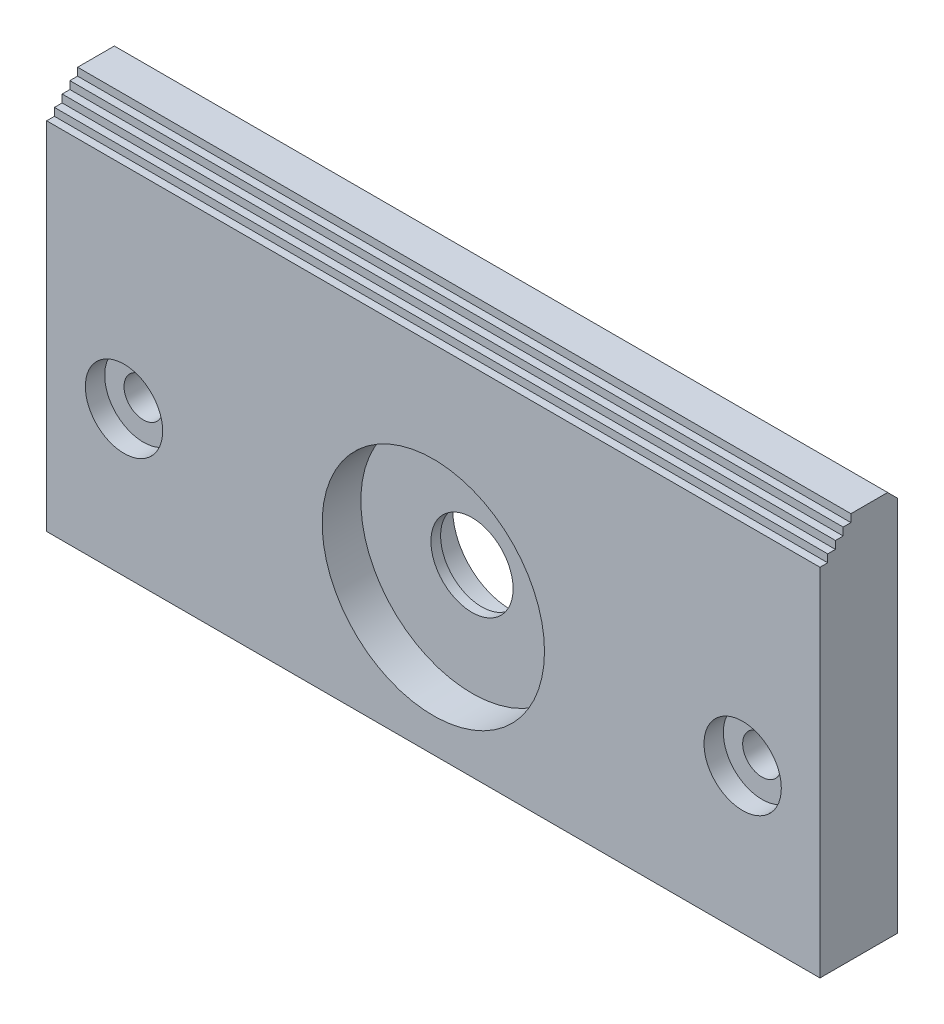
ISO-10303-21;
HEADER;
FILE_DESCRIPTION(('STEP AP214'),'2;1');
FILE_NAME('part.step','',(''),(''),'','','');
FILE_SCHEMA(('AUTOMOTIVE_DESIGN { 1 0 10303 214 1 1 1 1 }'));
ENDSEC;
DATA;
#1=APPLICATION_CONTEXT('core data for automotive mechanical design processes');
#2=APPLICATION_PROTOCOL_DEFINITION('international standard','automotive_design',2000,#1);
#3=PRODUCT_CONTEXT('',#1,'mechanical');
#4=PRODUCT('Part','Part','',(#3));
#5=PRODUCT_RELATED_PRODUCT_CATEGORY('part','',(#4));
#6=PRODUCT_DEFINITION_FORMATION('','',#4);
#7=PRODUCT_DEFINITION_CONTEXT('part definition',#1,'design');
#8=PRODUCT_DEFINITION('design','',#6,#7);
#9=PRODUCT_DEFINITION_SHAPE('','',#8);
#10=(LENGTH_UNIT() NAMED_UNIT(*) SI_UNIT(.MILLI.,.METRE.));
#11=(NAMED_UNIT(*) PLANE_ANGLE_UNIT() SI_UNIT($,.RADIAN.));
#12=(NAMED_UNIT(*) SI_UNIT($,.STERADIAN.) SOLID_ANGLE_UNIT());
#13=UNCERTAINTY_MEASURE_WITH_UNIT(LENGTH_MEASURE(1.E-05),#10,'distance_accuracy_value','');
#14=(GEOMETRIC_REPRESENTATION_CONTEXT(3) GLOBAL_UNCERTAINTY_ASSIGNED_CONTEXT((#13)) GLOBAL_UNIT_ASSIGNED_CONTEXT((#10,
#11,#12)) REPRESENTATION_CONTEXT('',''));
#15=CARTESIAN_POINT('',(0.,0.,0.));
#16=DIRECTION('',(0.,0.,1.));
#17=DIRECTION('',(1.,0.,0.));
#18=AXIS2_PLACEMENT_3D('',#15,#16,#17);
#19=CARTESIAN_POINT('',(40.,15.8333333333333,-0.0010000000000062));
#20=DIRECTION('',(0.,0.,1.));
#21=DIRECTION('',(1.,0.,0.));
#22=AXIS2_PLACEMENT_3D('',#19,#20,#21);
#23=CYLINDRICAL_SURFACE('',#22,4.25);
#24=CARTESIAN_POINT('',(40.,15.8333333333333,4.));
#25=DIRECTION('',(0.,0.,1.));
#26=DIRECTION('',(1.,0.,0.));
#27=AXIS2_PLACEMENT_3D('',#24,#25,#26);
#28=CIRCLE('',#27,4.25);
#29=CARTESIAN_POINT('',(44.25,15.8333333333333,4.));
#30=VERTEX_POINT('',#29);
#31=EDGE_CURVE('E296',#30,#30,#28,.F.);
#32=ORIENTED_EDGE('',*,*,#31,.F.);
#33=EDGE_LOOP('',(#32));
#34=FACE_BOUND('',#33,.T.);
#35=CARTESIAN_POINT('',(40.,15.8333333333333,3.));
#36=DIRECTION('',(0.,0.,-1.));
#37=DIRECTION('',(-1.,0.,0.));
#38=AXIS2_PLACEMENT_3D('',#35,#36,#37);
#39=CIRCLE('',#38,4.25);
#40=CARTESIAN_POINT('',(35.75,15.8333333333333,3.));
#41=VERTEX_POINT('',#40);
#42=EDGE_CURVE('E301',#41,#41,#39,.F.);
#43=ORIENTED_EDGE('',*,*,#42,.F.);
#44=EDGE_LOOP('',(#43));
#45=FACE_BOUND('',#44,.T.);
#46=ADVANCED_FACE('F163',(#34,#45),#23,.F.);
#47=CARTESIAN_POINT('',(80.,40.8333333333333,0.));
#48=DIRECTION('',(0.,1.,0.));
#49=DIRECTION('',(-1.,0.,0.));
#50=AXIS2_PLACEMENT_3D('',#47,#48,#49);
#51=PLANE('',#50);
#52=DIRECTION('',(-1.,0.,0.));
#53=VECTOR('',#52,1.);
#54=CARTESIAN_POINT('',(80.001,40.8333333333333,4.8));
#55=LINE('',#54,#53);
#56=CARTESIAN_POINT('',(80.,40.8333333333333,4.8));
#57=VERTEX_POINT('',#56);
#58=CARTESIAN_POINT('',(0.,40.8333333333333,4.8));
#59=VERTEX_POINT('',#58);
#60=EDGE_CURVE('E338',#57,#59,#55,.T.);
#61=ORIENTED_EDGE('',*,*,#60,.F.);
#62=DIRECTION('',(0.,0.,1.));
#63=VECTOR('',#62,1.);
#64=CARTESIAN_POINT('',(80.,40.8333333333333,0.));
#65=LINE('',#64,#63);
#66=CARTESIAN_POINT('',(80.,40.8333333333333,0.999999999999973));
#67=VERTEX_POINT('',#66);
#68=EDGE_CURVE('E293',#67,#57,#65,.T.);
#69=ORIENTED_EDGE('',*,*,#68,.F.);
#70=DIRECTION('',(-1.,0.,0.));
#71=VECTOR('',#70,1.);
#72=CARTESIAN_POINT('',(0.,40.8333333333333,0.999999999999973));
#73=LINE('',#72,#71);
#74=CARTESIAN_POINT('',(0.,40.8333333333333,0.999999999999973));
#75=VERTEX_POINT('',#74);
#76=EDGE_CURVE('E317',#67,#75,#73,.T.);
#77=ORIENTED_EDGE('',*,*,#76,.T.);
#78=DIRECTION('',(0.,0.,1.));
#79=VECTOR('',#78,1.);
#80=CARTESIAN_POINT('',(0.,40.8333333333333,0.));
#81=LINE('',#80,#79);
#82=EDGE_CURVE('E289',#75,#59,#81,.T.);
#83=ORIENTED_EDGE('',*,*,#82,.T.);
#84=EDGE_LOOP('',(#61,#69,#77,#83));
#85=FACE_BOUND('',#84,.T.);
#86=ADVANCED_FACE('F336',(#85),#51,.T.);
#87=CARTESIAN_POINT('',(0.,40.8333333333333,0.));
#88=DIRECTION('',(-1.,0.,0.));
#89=DIRECTION('',(0.,-1.,0.));
#90=AXIS2_PLACEMENT_3D('',#87,#88,#89);
#91=PLANE('',#90);
#92=DIRECTION('',(0.,0.,1.));
#93=VECTOR('',#92,1.);
#94=CARTESIAN_POINT('',(0.,37.6333333333333,7.2));
#95=LINE('',#94,#93);
#96=CARTESIAN_POINT('',(0.,37.6333333333333,7.2));
#97=VERTEX_POINT('',#96);
#98=CARTESIAN_POINT('',(0.,37.6333333333333,8.));
#99=VERTEX_POINT('',#98);
#100=EDGE_CURVE('E179',#97,#99,#95,.T.);
#101=ORIENTED_EDGE('',*,*,#100,.F.);
#102=DIRECTION('',(0.,-1.,0.));
#103=VECTOR('',#102,1.);
#104=CARTESIAN_POINT('',(0.,38.4333333333333,7.2));
#105=LINE('',#104,#103);
#106=CARTESIAN_POINT('',(0.,38.4333333333333,7.2));
#107=VERTEX_POINT('',#106);
#108=EDGE_CURVE('E346',#107,#97,#105,.T.);
#109=ORIENTED_EDGE('',*,*,#108,.F.);
#110=DIRECTION('',(0.,0.,1.));
#111=VECTOR('',#110,1.);
#112=CARTESIAN_POINT('',(0.,38.4333333333333,6.4));
#113=LINE('',#112,#111);
#114=CARTESIAN_POINT('',(0.,38.4333333333333,6.4));
#115=VERTEX_POINT('',#114);
#116=EDGE_CURVE('E400',#115,#107,#113,.T.);
#117=ORIENTED_EDGE('',*,*,#116,.F.);
#118=DIRECTION('',(0.,-1.,0.));
#119=VECTOR('',#118,1.);
#120=CARTESIAN_POINT('',(0.,39.2333333333333,6.4));
#121=LINE('',#120,#119);
#122=CARTESIAN_POINT('',(0.,39.2333333333333,6.4));
#123=VERTEX_POINT('',#122);
#124=EDGE_CURVE('E397',#123,#115,#121,.T.);
#125=ORIENTED_EDGE('',*,*,#124,.F.);
#126=DIRECTION('',(0.,0.,1.));
#127=VECTOR('',#126,1.);
#128=CARTESIAN_POINT('',(0.,39.2333333333333,5.6));
#129=LINE('',#128,#127);
#130=CARTESIAN_POINT('',(0.,39.2333333333333,5.6));
#131=VERTEX_POINT('',#130);
#132=EDGE_CURVE('E394',#131,#123,#129,.T.);
#133=ORIENTED_EDGE('',*,*,#132,.F.);
#134=DIRECTION('',(0.,-1.,0.));
#135=VECTOR('',#134,1.);
#136=CARTESIAN_POINT('',(0.,40.0333333333333,5.6));
#137=LINE('',#136,#135);
#138=CARTESIAN_POINT('',(0.,40.0333333333333,5.6));
#139=VERTEX_POINT('',#138);
#140=EDGE_CURVE('E388',#139,#131,#137,.T.);
#141=ORIENTED_EDGE('',*,*,#140,.F.);
#142=DIRECTION('',(0.,0.,1.));
#143=VECTOR('',#142,1.);
#144=CARTESIAN_POINT('',(0.,40.0333333333333,4.8));
#145=LINE('',#144,#143);
#146=CARTESIAN_POINT('',(0.,40.0333333333333,4.8));
#147=VERTEX_POINT('',#146);
#148=EDGE_CURVE('E385',#147,#139,#145,.T.);
#149=ORIENTED_EDGE('',*,*,#148,.F.);
#150=DIRECTION('',(0.,-1.,0.));
#151=VECTOR('',#150,1.);
#152=CARTESIAN_POINT('',(0.,40.8333333333333,4.8));
#153=LINE('',#152,#151);
#154=EDGE_CURVE('E270',#59,#147,#153,.T.);
#155=ORIENTED_EDGE('',*,*,#154,.F.);
#156=ORIENTED_EDGE('',*,*,#82,.F.);
#157=DIRECTION('',(0.,-0.707106781186552,-0.707106781186543));
#158=VECTOR('',#157,1.);
#159=CARTESIAN_POINT('',(0.,40.3333333333333,0.499999999999993));
#160=LINE('',#159,#158);
#161=CARTESIAN_POINT('',(0.,39.8333333333333,0.));
#162=VERTEX_POINT('',#161);
#163=EDGE_CURVE('E320',#75,#162,#160,.T.);
#164=ORIENTED_EDGE('',*,*,#163,.T.);
#165=DIRECTION('',(0.,-1.,0.));
#166=VECTOR('',#165,1.);
#167=CARTESIAN_POINT('',(0.,40.8333333333333,0.));
#168=LINE('',#167,#166);
#169=CARTESIAN_POINT('',(0.,0.833333333333342,0.));
#170=VERTEX_POINT('',#169);
#171=EDGE_CURVE('E286',#162,#170,#168,.T.);
#172=ORIENTED_EDGE('',*,*,#171,.T.);
#173=DIRECTION('',(0.,0.,1.));
#174=VECTOR('',#173,1.);
#175=CARTESIAN_POINT('',(0.,0.833333333333342,-0.000999999999999265));
#176=LINE('',#175,#174);
#177=CARTESIAN_POINT('',(0.,0.833333333333342,8.));
#178=VERTEX_POINT('',#177);
#179=EDGE_CURVE('E355',#170,#178,#176,.T.);
#180=ORIENTED_EDGE('',*,*,#179,.T.);
#181=DIRECTION('',(0.,-1.,0.));
#182=VECTOR('',#181,1.);
#183=CARTESIAN_POINT('',(0.,40.8333333333333,8.));
#184=LINE('',#183,#182);
#185=EDGE_CURVE('E277',#99,#178,#184,.T.);
#186=ORIENTED_EDGE('',*,*,#185,.F.);
#187=EDGE_LOOP('',(#101,#109,#117,#125,#133,#141,#149,#155,#156,#164,#172,#180,#186));
#188=FACE_BOUND('',#187,.T.);
#189=ADVANCED_FACE('F381',(#188),#91,.T.);
#190=CARTESIAN_POINT('',(80.,-19.1666666666667,0.));
#191=DIRECTION('',(1.,0.,0.));
#192=DIRECTION('',(0.,0.,-1.));
#193=AXIS2_PLACEMENT_3D('',#190,#191,#192);
#194=PLANE('',#193);
#195=DIRECTION('',(0.,0.,1.));
#196=VECTOR('',#195,1.);
#197=CARTESIAN_POINT('',(80.,37.6333333333333,7.2));
#198=LINE('',#197,#196);
#199=CARTESIAN_POINT('',(80.,37.6333333333333,7.2));
#200=VERTEX_POINT('',#199);
#201=CARTESIAN_POINT('',(80.,37.6333333333333,8.));
#202=VERTEX_POINT('',#201);
#203=EDGE_CURVE('E259',#200,#202,#198,.T.);
#204=ORIENTED_EDGE('',*,*,#203,.T.);
#205=DIRECTION('',(0.,1.,0.));
#206=VECTOR('',#205,1.);
#207=CARTESIAN_POINT('',(80.,-19.1666666666667,8.));
#208=LINE('',#207,#206);
#209=CARTESIAN_POINT('',(80.,0.833333333333342,8.));
#210=VERTEX_POINT('',#209);
#211=EDGE_CURVE('E187',#210,#202,#208,.T.);
#212=ORIENTED_EDGE('',*,*,#211,.F.);
#213=DIRECTION('',(0.,0.,1.));
#214=VECTOR('',#213,1.);
#215=CARTESIAN_POINT('',(80.,0.833333333333342,-0.000999999999999265));
#216=LINE('',#215,#214);
#217=CARTESIAN_POINT('',(80.,0.833333333333342,0.));
#218=VERTEX_POINT('',#217);
#219=EDGE_CURVE('E354',#218,#210,#216,.T.);
#220=ORIENTED_EDGE('',*,*,#219,.F.);
#221=DIRECTION('',(0.,1.,0.));
#222=VECTOR('',#221,1.);
#223=CARTESIAN_POINT('',(80.,-19.1666666666667,0.));
#224=LINE('',#223,#222);
#225=CARTESIAN_POINT('',(80.,39.8333333333334,0.));
#226=VERTEX_POINT('',#225);
#227=EDGE_CURVE('E280',#218,#226,#224,.T.);
#228=ORIENTED_EDGE('',*,*,#227,.T.);
#229=DIRECTION('',(0.,0.707106781186552,0.707106781186543));
#230=VECTOR('',#229,1.);
#231=CARTESIAN_POINT('',(80.,10.3333333333329,-29.5));
#232=LINE('',#231,#230);
#233=EDGE_CURVE('E12',#226,#67,#232,.T.);
#234=ORIENTED_EDGE('',*,*,#233,.T.);
#235=ORIENTED_EDGE('',*,*,#68,.T.);
#236=DIRECTION('',(0.,-1.,0.));
#237=VECTOR('',#236,1.);
#238=CARTESIAN_POINT('',(80.,40.8333333333333,4.8));
#239=LINE('',#238,#237);
#240=CARTESIAN_POINT('',(80.,40.0333333333333,4.8));
#241=VERTEX_POINT('',#240);
#242=EDGE_CURVE('E263',#57,#241,#239,.T.);
#243=ORIENTED_EDGE('',*,*,#242,.T.);
#244=DIRECTION('',(0.,0.,1.));
#245=VECTOR('',#244,1.);
#246=CARTESIAN_POINT('',(80.,40.0333333333333,4.8));
#247=LINE('',#246,#245);
#248=CARTESIAN_POINT('',(80.,40.0333333333333,5.6));
#249=VERTEX_POINT('',#248);
#250=EDGE_CURVE('E431',#241,#249,#247,.T.);
#251=ORIENTED_EDGE('',*,*,#250,.T.);
#252=DIRECTION('',(0.,-1.,0.));
#253=VECTOR('',#252,1.);
#254=CARTESIAN_POINT('',(80.,40.0333333333333,5.6));
#255=LINE('',#254,#253);
#256=CARTESIAN_POINT('',(80.,39.2333333333333,5.6));
#257=VERTEX_POINT('',#256);
#258=EDGE_CURVE('E419',#249,#257,#255,.T.);
#259=ORIENTED_EDGE('',*,*,#258,.T.);
#260=DIRECTION('',(0.,0.,1.));
#261=VECTOR('',#260,1.);
#262=CARTESIAN_POINT('',(80.,39.2333333333333,5.6));
#263=LINE('',#262,#261);
#264=CARTESIAN_POINT('',(80.,39.2333333333333,6.4));
#265=VERTEX_POINT('',#264);
#266=EDGE_CURVE('E429',#257,#265,#263,.T.);
#267=ORIENTED_EDGE('',*,*,#266,.T.);
#268=DIRECTION('',(0.,-1.,0.));
#269=VECTOR('',#268,1.);
#270=CARTESIAN_POINT('',(80.,39.2333333333333,6.4));
#271=LINE('',#270,#269);
#272=CARTESIAN_POINT('',(80.,38.4333333333333,6.4));
#273=VERTEX_POINT('',#272);
#274=EDGE_CURVE('E433',#265,#273,#271,.T.);
#275=ORIENTED_EDGE('',*,*,#274,.T.);
#276=DIRECTION('',(0.,0.,1.));
#277=VECTOR('',#276,1.);
#278=CARTESIAN_POINT('',(80.,38.4333333333333,6.4));
#279=LINE('',#278,#277);
#280=CARTESIAN_POINT('',(80.,38.4333333333333,7.2));
#281=VERTEX_POINT('',#280);
#282=EDGE_CURVE('E438',#273,#281,#279,.T.);
#283=ORIENTED_EDGE('',*,*,#282,.T.);
#284=DIRECTION('',(0.,-1.,0.));
#285=VECTOR('',#284,1.);
#286=CARTESIAN_POINT('',(80.,38.4333333333333,7.2));
#287=LINE('',#286,#285);
#288=EDGE_CURVE('E269',#281,#200,#287,.T.);
#289=ORIENTED_EDGE('',*,*,#288,.T.);
#290=EDGE_LOOP('',(#204,#212,#220,#228,#234,#235,#243,#251,#259,#267,#275,#283,#289));
#291=FACE_BOUND('',#290,.T.);
#292=ADVANCED_FACE('F267',(#291),#194,.T.);
#293=CARTESIAN_POINT('',(0.,0.,0.));
#294=DIRECTION('',(0.,0.,1.));
#295=DIRECTION('',(1.,0.,0.));
#296=AXIS2_PLACEMENT_3D('',#293,#294,#295);
#297=PLANE('',#296);
#298=CARTESIAN_POINT('',(72.,15.8333333333334,0.));
#299=DIRECTION('',(0.,0.,1.));
#300=DIRECTION('',(1.,0.,0.));
#301=AXIS2_PLACEMENT_3D('',#298,#299,#300);
#302=CIRCLE('',#301,3.50000000127192);
#303=CARTESIAN_POINT('',(75.5000000012719,15.8333333333334,0.));
#304=VERTEX_POINT('',#303);
#305=EDGE_CURVE('E308',#304,#304,#302,.T.);
#306=ORIENTED_EDGE('',*,*,#305,.T.);
#307=EDGE_LOOP('',(#306));
#308=FACE_BOUND('',#307,.T.);
#309=CARTESIAN_POINT('',(8.,15.8333333333334,0.));
#310=DIRECTION('',(0.,0.,1.));
#311=DIRECTION('',(1.,0.,0.));
#312=AXIS2_PLACEMENT_3D('',#309,#310,#311);
#313=CIRCLE('',#312,3.50000000127192);
#314=CARTESIAN_POINT('',(11.5000000012719,15.8333333333334,0.));
#315=VERTEX_POINT('',#314);
#316=EDGE_CURVE('E292',#315,#315,#313,.T.);
#317=ORIENTED_EDGE('',*,*,#316,.T.);
#318=EDGE_LOOP('',(#317));
#319=FACE_BOUND('',#318,.T.);
#320=CARTESIAN_POINT('',(40.,15.8333333333333,0.));
#321=DIRECTION('',(0.,0.,-1.));
#322=DIRECTION('',(-1.,0.,0.));
#323=AXIS2_PLACEMENT_3D('',#320,#321,#322);
#324=CIRCLE('',#323,5.99999999999999);
#325=CARTESIAN_POINT('',(34.,15.8333333333333,0.));
#326=VERTEX_POINT('',#325);
#327=EDGE_CURVE('E358',#326,#326,#324,.T.);
#328=ORIENTED_EDGE('',*,*,#327,.F.);
#329=EDGE_LOOP('',(#328));
#330=FACE_BOUND('',#329,.T.);
#331=ORIENTED_EDGE('',*,*,#227,.F.);
#332=DIRECTION('',(1.,0.,0.));
#333=VECTOR('',#332,1.);
#334=CARTESIAN_POINT('',(0.,0.833333333333342,0.));
#335=LINE('',#334,#333);
#336=EDGE_CURVE('E351',#170,#218,#335,.T.);
#337=ORIENTED_EDGE('',*,*,#336,.F.);
#338=ORIENTED_EDGE('',*,*,#171,.F.);
#339=DIRECTION('',(1.,0.,0.));
#340=VECTOR('',#339,1.);
#341=CARTESIAN_POINT('',(80.,39.8333333333334,0.));
#342=LINE('',#341,#340);
#343=EDGE_CURVE('E172',#162,#226,#342,.T.);
#344=ORIENTED_EDGE('',*,*,#343,.T.);
#345=EDGE_LOOP('',(#331,#337,#338,#344));
#346=FACE_BOUND('',#345,.T.);
#347=ADVANCED_FACE('F327',(#308,#319,#330,#346),#297,.F.);
#348=CARTESIAN_POINT('',(0.,0.,8.));
#349=DIRECTION('',(0.,0.,1.));
#350=DIRECTION('',(1.,0.,0.));
#351=AXIS2_PLACEMENT_3D('',#348,#349,#350);
#352=PLANE('',#351);
#353=DIRECTION('',(-1.,0.,0.));
#354=VECTOR('',#353,1.);
#355=CARTESIAN_POINT('',(80.001,37.6333333333333,8.));
#356=LINE('',#355,#354);
#357=EDGE_CURVE('E257',#202,#99,#356,.T.);
#358=ORIENTED_EDGE('',*,*,#357,.T.);
#359=ORIENTED_EDGE('',*,*,#185,.T.);
#360=DIRECTION('',(-1.,0.,0.));
#361=VECTOR('',#360,1.);
#362=CARTESIAN_POINT('',(0.,0.833333333333342,8.));
#363=LINE('',#362,#361);
#364=EDGE_CURVE('E276',#210,#178,#363,.T.);
#365=ORIENTED_EDGE('',*,*,#364,.F.);
#366=ORIENTED_EDGE('',*,*,#211,.T.);
#367=EDGE_LOOP('',(#358,#359,#365,#366));
#368=FACE_BOUND('',#367,.T.);
#369=CARTESIAN_POINT('',(40.,15.8333333333333,8.));
#370=DIRECTION('',(0.,0.,1.));
#371=DIRECTION('',(1.,0.,0.));
#372=AXIS2_PLACEMENT_3D('',#369,#370,#371);
#373=CIRCLE('',#372,11.5);
#374=CARTESIAN_POINT('',(51.5,15.8333333333333,8.));
#375=VERTEX_POINT('',#374);
#376=EDGE_CURVE('E304',#375,#375,#373,.T.);
#377=ORIENTED_EDGE('',*,*,#376,.F.);
#378=EDGE_LOOP('',(#377));
#379=FACE_BOUND('',#378,.T.);
#380=CARTESIAN_POINT('',(8.,15.8333333333334,8.));
#381=DIRECTION('',(0.,0.,1.));
#382=DIRECTION('',(1.,0.,0.));
#383=AXIS2_PLACEMENT_3D('',#380,#381,#382);
#384=CIRCLE('',#383,4.);
#385=CARTESIAN_POINT('',(12.,15.8333333333334,8.));
#386=VERTEX_POINT('',#385);
#387=EDGE_CURVE('E299',#386,#386,#384,.T.);
#388=ORIENTED_EDGE('',*,*,#387,.F.);
#389=EDGE_LOOP('',(#388));
#390=FACE_BOUND('',#389,.T.);
#391=CARTESIAN_POINT('',(72.,15.8333333333334,8.));
#392=DIRECTION('',(0.,0.,1.));
#393=DIRECTION('',(1.,0.,0.));
#394=AXIS2_PLACEMENT_3D('',#391,#392,#393);
#395=CIRCLE('',#394,4.);
#396=CARTESIAN_POINT('',(76.,15.8333333333334,8.));
#397=VERTEX_POINT('',#396);
#398=EDGE_CURVE('E376',#397,#397,#395,.T.);
#399=ORIENTED_EDGE('',*,*,#398,.F.);
#400=EDGE_LOOP('',(#399));
#401=FACE_BOUND('',#400,.T.);
#402=ADVANCED_FACE('F273',(#368,#379,#390,#401),#352,.T.);
#403=CARTESIAN_POINT('',(72.,15.8333333333334,8.));
#404=DIRECTION('',(0.,0.,1.));
#405=DIRECTION('',(1.,0.,0.));
#406=AXIS2_PLACEMENT_3D('',#403,#404,#405);
#407=CYLINDRICAL_SURFACE('',#406,2.00000000000002);
#408=CARTESIAN_POINT('',(72.,15.8333333333334,1.49999999854342));
#409=DIRECTION('',(0.,0.,1.));
#410=DIRECTION('',(1.,0.,0.));
#411=AXIS2_PLACEMENT_3D('',#408,#409,#410);
#412=CIRCLE('',#411,2.00000000000002);
#413=CARTESIAN_POINT('',(74.,15.8333333333334,1.49999999854342));
#414=VERTEX_POINT('',#413);
#415=EDGE_CURVE('E311',#414,#414,#412,.F.);
#416=ORIENTED_EDGE('',*,*,#415,.T.);
#417=EDGE_LOOP('',(#416));
#418=FACE_BOUND('',#417,.T.);
#419=CARTESIAN_POINT('',(72.,15.8333333333334,6.));
#420=DIRECTION('',(0.,0.,1.));
#421=DIRECTION('',(1.,0.,0.));
#422=AXIS2_PLACEMENT_3D('',#419,#420,#421);
#423=CIRCLE('',#422,2.00000000000002);
#424=CARTESIAN_POINT('',(74.,15.8333333333334,6.));
#425=VERTEX_POINT('',#424);
#426=EDGE_CURVE('E278',#425,#425,#423,.T.);
#427=ORIENTED_EDGE('',*,*,#426,.T.);
#428=EDGE_LOOP('',(#427));
#429=FACE_BOUND('',#428,.T.);
#430=ADVANCED_FACE('F490',(#418,#429),#407,.F.);
#431=CARTESIAN_POINT('',(74.,15.8333333333334,6.));
#432=DIRECTION('',(0.,0.,-1.));
#433=DIRECTION('',(-1.,0.,0.));
#434=AXIS2_PLACEMENT_3D('',#431,#432,#433);
#435=PLANE('',#434);
#436=ORIENTED_EDGE('',*,*,#426,.F.);
#437=EDGE_LOOP('',(#436));
#438=FACE_BOUND('',#437,.T.);
#439=CARTESIAN_POINT('',(72.,15.8333333333334,6.));
#440=DIRECTION('',(0.,0.,1.));
#441=DIRECTION('',(1.,0.,0.));
#442=AXIS2_PLACEMENT_3D('',#439,#440,#441);
#443=CIRCLE('',#442,4.);
#444=CARTESIAN_POINT('',(76.,15.8333333333334,6.));
#445=VERTEX_POINT('',#444);
#446=EDGE_CURVE('E283',#445,#445,#443,.T.);
#447=ORIENTED_EDGE('',*,*,#446,.T.);
#448=EDGE_LOOP('',(#447));
#449=FACE_BOUND('',#448,.T.);
#450=ADVANCED_FACE('F486',(#438,#449),#435,.F.);
#451=CARTESIAN_POINT('',(72.,15.8333333333334,8.));
#452=DIRECTION('',(0.,0.,1.));
#453=DIRECTION('',(1.,0.,0.));
#454=AXIS2_PLACEMENT_3D('',#451,#452,#453);
#455=CYLINDRICAL_SURFACE('',#454,4.);
#456=ORIENTED_EDGE('',*,*,#446,.F.);
#457=EDGE_LOOP('',(#456));
#458=FACE_BOUND('',#457,.T.);
#459=ORIENTED_EDGE('',*,*,#398,.T.);
#460=EDGE_LOOP('',(#459));
#461=FACE_BOUND('',#460,.T.);
#462=ADVANCED_FACE('F482',(#458,#461),#455,.F.);
#463=CARTESIAN_POINT('',(8.,15.8333333333334,8.));
#464=DIRECTION('',(0.,0.,1.));
#465=DIRECTION('',(1.,0.,0.));
#466=AXIS2_PLACEMENT_3D('',#463,#464,#465);
#467=CYLINDRICAL_SURFACE('',#466,2.00000000000001);
#468=CARTESIAN_POINT('',(8.,15.8333333333334,1.49999999854344));
#469=DIRECTION('',(0.,0.,1.));
#470=DIRECTION('',(1.,0.,0.));
#471=AXIS2_PLACEMENT_3D('',#468,#469,#470);
#472=CIRCLE('',#471,2.00000000000001);
#473=CARTESIAN_POINT('',(10.,15.8333333333334,1.49999999854344));
#474=VERTEX_POINT('',#473);
#475=EDGE_CURVE('E314',#474,#474,#472,.F.);
#476=ORIENTED_EDGE('',*,*,#475,.T.);
#477=EDGE_LOOP('',(#476));
#478=FACE_BOUND('',#477,.T.);
#479=CARTESIAN_POINT('',(8.,15.8333333333334,6.));
#480=DIRECTION('',(0.,0.,1.));
#481=DIRECTION('',(1.,0.,0.));
#482=AXIS2_PLACEMENT_3D('',#479,#480,#481);
#483=CIRCLE('',#482,2.00000000000001);
#484=CARTESIAN_POINT('',(10.,15.8333333333334,6.));
#485=VERTEX_POINT('',#484);
#486=EDGE_CURVE('E373',#485,#485,#483,.T.);
#487=ORIENTED_EDGE('',*,*,#486,.T.);
#488=EDGE_LOOP('',(#487));
#489=FACE_BOUND('',#488,.T.);
#490=ADVANCED_FACE('F478',(#478,#489),#467,.F.);
#491=CARTESIAN_POINT('',(10.,15.8333333333334,6.));
#492=DIRECTION('',(0.,0.,-1.));
#493=DIRECTION('',(-1.,0.,0.));
#494=AXIS2_PLACEMENT_3D('',#491,#492,#493);
#495=PLANE('',#494);
#496=ORIENTED_EDGE('',*,*,#486,.F.);
#497=EDGE_LOOP('',(#496));
#498=FACE_BOUND('',#497,.T.);
#499=CARTESIAN_POINT('',(8.,15.8333333333334,6.));
#500=DIRECTION('',(0.,0.,1.));
#501=DIRECTION('',(1.,0.,0.));
#502=AXIS2_PLACEMENT_3D('',#499,#500,#501);
#503=CIRCLE('',#502,4.);
#504=CARTESIAN_POINT('',(12.,15.8333333333334,6.));
#505=VERTEX_POINT('',#504);
#506=EDGE_CURVE('E370',#505,#505,#503,.T.);
#507=ORIENTED_EDGE('',*,*,#506,.T.);
#508=EDGE_LOOP('',(#507));
#509=FACE_BOUND('',#508,.T.);
#510=ADVANCED_FACE('F474',(#498,#509),#495,.F.);
#511=CARTESIAN_POINT('',(8.,15.8333333333334,8.));
#512=DIRECTION('',(0.,0.,1.));
#513=DIRECTION('',(1.,0.,0.));
#514=AXIS2_PLACEMENT_3D('',#511,#512,#513);
#515=CYLINDRICAL_SURFACE('',#514,4.);
#516=ORIENTED_EDGE('',*,*,#506,.F.);
#517=EDGE_LOOP('',(#516));
#518=FACE_BOUND('',#517,.T.);
#519=ORIENTED_EDGE('',*,*,#387,.T.);
#520=EDGE_LOOP('',(#519));
#521=FACE_BOUND('',#520,.T.);
#522=ADVANCED_FACE('F470',(#518,#521),#515,.F.);
#523=CARTESIAN_POINT('',(40.,15.8333333333333,4.));
#524=DIRECTION('',(0.,0.,1.));
#525=DIRECTION('',(1.,0.,0.));
#526=AXIS2_PLACEMENT_3D('',#523,#524,#525);
#527=PLANE('',#526);
#528=CARTESIAN_POINT('',(40.,15.8333333333333,4.));
#529=DIRECTION('',(0.,0.,1.));
#530=DIRECTION('',(1.,0.,0.));
#531=AXIS2_PLACEMENT_3D('',#528,#529,#530);
#532=CIRCLE('',#531,11.5);
#533=CARTESIAN_POINT('',(51.5,15.8333333333333,4.));
#534=VERTEX_POINT('',#533);
#535=EDGE_CURVE('E300',#534,#534,#532,.T.);
#536=ORIENTED_EDGE('',*,*,#535,.T.);
#537=EDGE_LOOP('',(#536));
#538=FACE_BOUND('',#537,.T.);
#539=ORIENTED_EDGE('',*,*,#31,.T.);
#540=EDGE_LOOP('',(#539));
#541=FACE_BOUND('',#540,.T.);
#542=ADVANCED_FACE('F473',(#538,#541),#527,.T.);
#543=CARTESIAN_POINT('',(40.,15.8333333333333,4.));
#544=DIRECTION('',(0.,0.,1.));
#545=DIRECTION('',(1.,0.,0.));
#546=AXIS2_PLACEMENT_3D('',#543,#544,#545);
#547=CYLINDRICAL_SURFACE('',#546,11.5);
#548=ORIENTED_EDGE('',*,*,#376,.T.);
#549=EDGE_LOOP('',(#548));
#550=FACE_BOUND('',#549,.T.);
#551=ORIENTED_EDGE('',*,*,#535,.F.);
#552=EDGE_LOOP('',(#551));
#553=FACE_BOUND('',#552,.T.);
#554=ADVANCED_FACE('F468',(#550,#553),#547,.F.);
#555=CARTESIAN_POINT('',(40.,15.8333333333333,3.));
#556=DIRECTION('',(0.,0.,-1.));
#557=DIRECTION('',(-1.,0.,0.));
#558=AXIS2_PLACEMENT_3D('',#555,#556,#557);
#559=PLANE('',#558);
#560=CARTESIAN_POINT('',(40.,15.8333333333333,3.));
#561=DIRECTION('',(0.,0.,-1.));
#562=DIRECTION('',(-1.,0.,0.));
#563=AXIS2_PLACEMENT_3D('',#560,#561,#562);
#564=CIRCLE('',#563,5.99999999999999);
#565=CARTESIAN_POINT('',(34.,15.8333333333333,3.));
#566=VERTEX_POINT('',#565);
#567=EDGE_CURVE('E305',#566,#566,#564,.T.);
#568=ORIENTED_EDGE('',*,*,#567,.T.);
#569=EDGE_LOOP('',(#568));
#570=FACE_BOUND('',#569,.T.);
#571=ORIENTED_EDGE('',*,*,#42,.T.);
#572=EDGE_LOOP('',(#571));
#573=FACE_BOUND('',#572,.T.);
#574=ADVANCED_FACE('F528',(#570,#573),#559,.T.);
#575=CARTESIAN_POINT('',(40.,15.8333333333333,3.));
#576=DIRECTION('',(0.,0.,-1.));
#577=DIRECTION('',(-1.,0.,0.));
#578=AXIS2_PLACEMENT_3D('',#575,#576,#577);
#579=CYLINDRICAL_SURFACE('',#578,5.99999999999999);
#580=ORIENTED_EDGE('',*,*,#567,.F.);
#581=EDGE_LOOP('',(#580));
#582=FACE_BOUND('',#581,.T.);
#583=ORIENTED_EDGE('',*,*,#327,.T.);
#584=EDGE_LOOP('',(#583));
#585=FACE_BOUND('',#584,.T.);
#586=ADVANCED_FACE('F511',(#582,#585),#579,.F.);
#587=CARTESIAN_POINT('',(72.,15.8333333333334,0.));
#588=DIRECTION('',(0.,0.,-1.));
#589=DIRECTION('',(-1.,0.,0.));
#590=AXIS2_PLACEMENT_3D('',#587,#588,#589);
#591=CONICAL_SURFACE('',#590,3.50000000127192,0.785398164306943);
#592=ORIENTED_EDGE('',*,*,#415,.F.);
#593=EDGE_LOOP('',(#592));
#594=FACE_BOUND('',#593,.T.);
#595=ORIENTED_EDGE('',*,*,#305,.F.);
#596=EDGE_LOOP('',(#595));
#597=FACE_BOUND('',#596,.T.);
#598=ADVANCED_FACE('F505',(#594,#597),#591,.F.);
#599=CARTESIAN_POINT('',(8.,15.8333333333334,0.));
#600=DIRECTION('',(0.,0.,-1.));
#601=DIRECTION('',(-1.,0.,0.));
#602=AXIS2_PLACEMENT_3D('',#599,#600,#601);
#603=CONICAL_SURFACE('',#602,3.50000000127192,0.785398164306938);
#604=ORIENTED_EDGE('',*,*,#475,.F.);
#605=EDGE_LOOP('',(#604));
#606=FACE_BOUND('',#605,.T.);
#607=ORIENTED_EDGE('',*,*,#316,.F.);
#608=EDGE_LOOP('',(#607));
#609=FACE_BOUND('',#608,.T.);
#610=ADVANCED_FACE('F510',(#606,#609),#603,.F.);
#611=CARTESIAN_POINT('',(80.,40.8333333333333,0.999999999999973));
#612=DIRECTION('',(0.,0.707106781186543,-0.707106781186552));
#613=DIRECTION('',(1.,0.,0.));
#614=AXIS2_PLACEMENT_3D('',#611,#612,#613);
#615=PLANE('',#614);
#616=ORIENTED_EDGE('',*,*,#233,.F.);
#617=ORIENTED_EDGE('',*,*,#343,.F.);
#618=ORIENTED_EDGE('',*,*,#163,.F.);
#619=ORIENTED_EDGE('',*,*,#76,.F.);
#620=EDGE_LOOP('',(#616,#617,#618,#619));
#621=FACE_BOUND('',#620,.T.);
#622=ADVANCED_FACE('F166',(#621),#615,.T.);
#623=CARTESIAN_POINT('',(0.,0.833333333333342,-0.000999999999999265));
#624=DIRECTION('',(0.,1.,0.));
#625=DIRECTION('',(0.,0.,1.));
#626=AXIS2_PLACEMENT_3D('',#623,#624,#625);
#627=PLANE('',#626);
#628=ORIENTED_EDGE('',*,*,#336,.T.);
#629=ORIENTED_EDGE('',*,*,#219,.T.);
#630=ORIENTED_EDGE('',*,*,#364,.T.);
#631=ORIENTED_EDGE('',*,*,#179,.F.);
#632=EDGE_LOOP('',(#628,#629,#630,#631));
#633=FACE_BOUND('',#632,.T.);
#634=ADVANCED_FACE('F455',(#633),#627,.F.);
#635=CARTESIAN_POINT('',(80.001,37.6333333333333,7.2));
#636=DIRECTION('',(0.,-1.,0.));
#637=DIRECTION('',(1.,0.,0.));
#638=AXIS2_PLACEMENT_3D('',#635,#636,#637);
#639=PLANE('',#638);
#640=DIRECTION('',(-1.,0.,0.));
#641=VECTOR('',#640,1.);
#642=CARTESIAN_POINT('',(80.001,37.6333333333333,7.2));
#643=LINE('',#642,#641);
#644=EDGE_CURVE('E264',#200,#97,#643,.T.);
#645=ORIENTED_EDGE('',*,*,#644,.T.);
#646=ORIENTED_EDGE('',*,*,#100,.T.);
#647=ORIENTED_EDGE('',*,*,#357,.F.);
#648=ORIENTED_EDGE('',*,*,#203,.F.);
#649=EDGE_LOOP('',(#645,#646,#647,#648));
#650=FACE_BOUND('',#649,.T.);
#651=ADVANCED_FACE('F258',(#650),#639,.F.);
#652=CARTESIAN_POINT('',(80.001,38.4333333333333,7.2));
#653=DIRECTION('',(0.,0.,-1.));
#654=DIRECTION('',(0.,1.,0.));
#655=AXIS2_PLACEMENT_3D('',#652,#653,#654);
#656=PLANE('',#655);
#657=DIRECTION('',(-1.,0.,0.));
#658=VECTOR('',#657,1.);
#659=CARTESIAN_POINT('',(80.001,38.4333333333333,7.2));
#660=LINE('',#659,#658);
#661=EDGE_CURVE('E406',#281,#107,#660,.T.);
#662=ORIENTED_EDGE('',*,*,#661,.T.);
#663=ORIENTED_EDGE('',*,*,#108,.T.);
#664=ORIENTED_EDGE('',*,*,#644,.F.);
#665=ORIENTED_EDGE('',*,*,#288,.F.);
#666=EDGE_LOOP('',(#662,#663,#664,#665));
#667=FACE_BOUND('',#666,.T.);
#668=ADVANCED_FACE('F447',(#667),#656,.F.);
#669=CARTESIAN_POINT('',(80.001,38.4333333333333,6.4));
#670=DIRECTION('',(0.,-1.,0.));
#671=DIRECTION('',(1.,0.,0.));
#672=AXIS2_PLACEMENT_3D('',#669,#670,#671);
#673=PLANE('',#672);
#674=DIRECTION('',(-1.,0.,0.));
#675=VECTOR('',#674,1.);
#676=CARTESIAN_POINT('',(80.001,38.4333333333333,6.4));
#677=LINE('',#676,#675);
#678=EDGE_CURVE('E408',#273,#115,#677,.T.);
#679=ORIENTED_EDGE('',*,*,#678,.T.);
#680=ORIENTED_EDGE('',*,*,#116,.T.);
#681=ORIENTED_EDGE('',*,*,#661,.F.);
#682=ORIENTED_EDGE('',*,*,#282,.F.);
#683=EDGE_LOOP('',(#679,#680,#681,#682));
#684=FACE_BOUND('',#683,.T.);
#685=ADVANCED_FACE('F442',(#684),#673,.F.);
#686=CARTESIAN_POINT('',(80.001,39.2333333333333,6.4));
#687=DIRECTION('',(0.,0.,-1.));
#688=DIRECTION('',(0.,1.,0.));
#689=AXIS2_PLACEMENT_3D('',#686,#687,#688);
#690=PLANE('',#689);
#691=DIRECTION('',(-1.,0.,0.));
#692=VECTOR('',#691,1.);
#693=CARTESIAN_POINT('',(80.001,39.2333333333333,6.4));
#694=LINE('',#693,#692);
#695=EDGE_CURVE('E410',#265,#123,#694,.T.);
#696=ORIENTED_EDGE('',*,*,#695,.T.);
#697=ORIENTED_EDGE('',*,*,#124,.T.);
#698=ORIENTED_EDGE('',*,*,#678,.F.);
#699=ORIENTED_EDGE('',*,*,#274,.F.);
#700=EDGE_LOOP('',(#696,#697,#698,#699));
#701=FACE_BOUND('',#700,.T.);
#702=ADVANCED_FACE('F444',(#701),#690,.F.);
#703=CARTESIAN_POINT('',(80.001,39.2333333333333,5.6));
#704=DIRECTION('',(0.,-1.,0.));
#705=DIRECTION('',(1.,0.,0.));
#706=AXIS2_PLACEMENT_3D('',#703,#704,#705);
#707=PLANE('',#706);
#708=DIRECTION('',(-1.,0.,0.));
#709=VECTOR('',#708,1.);
#710=CARTESIAN_POINT('',(80.001,39.2333333333333,5.6));
#711=LINE('',#710,#709);
#712=EDGE_CURVE('E412',#257,#131,#711,.T.);
#713=ORIENTED_EDGE('',*,*,#712,.T.);
#714=ORIENTED_EDGE('',*,*,#132,.T.);
#715=ORIENTED_EDGE('',*,*,#695,.F.);
#716=ORIENTED_EDGE('',*,*,#266,.F.);
#717=EDGE_LOOP('',(#713,#714,#715,#716));
#718=FACE_BOUND('',#717,.T.);
#719=ADVANCED_FACE('F427',(#718),#707,.F.);
#720=CARTESIAN_POINT('',(80.001,40.0333333333333,5.6));
#721=DIRECTION('',(0.,0.,-1.));
#722=DIRECTION('',(-1.,0.,0.));
#723=AXIS2_PLACEMENT_3D('',#720,#721,#722);
#724=PLANE('',#723);
#725=DIRECTION('',(-1.,0.,0.));
#726=VECTOR('',#725,1.);
#727=CARTESIAN_POINT('',(80.001,40.0333333333333,5.6));
#728=LINE('',#727,#726);
#729=EDGE_CURVE('E344',#249,#139,#728,.T.);
#730=ORIENTED_EDGE('',*,*,#729,.T.);
#731=ORIENTED_EDGE('',*,*,#140,.T.);
#732=ORIENTED_EDGE('',*,*,#712,.F.);
#733=ORIENTED_EDGE('',*,*,#258,.F.);
#734=EDGE_LOOP('',(#730,#731,#732,#733));
#735=FACE_BOUND('',#734,.T.);
#736=ADVANCED_FACE('F415',(#735),#724,.F.);
#737=CARTESIAN_POINT('',(80.001,40.0333333333333,4.8));
#738=DIRECTION('',(0.,-1.,0.));
#739=DIRECTION('',(1.,0.,0.));
#740=AXIS2_PLACEMENT_3D('',#737,#738,#739);
#741=PLANE('',#740);
#742=DIRECTION('',(-1.,0.,0.));
#743=VECTOR('',#742,1.);
#744=CARTESIAN_POINT('',(80.001,40.0333333333333,4.8));
#745=LINE('',#744,#743);
#746=EDGE_CURVE('E342',#241,#147,#745,.T.);
#747=ORIENTED_EDGE('',*,*,#746,.T.);
#748=ORIENTED_EDGE('',*,*,#148,.T.);
#749=ORIENTED_EDGE('',*,*,#729,.F.);
#750=ORIENTED_EDGE('',*,*,#250,.F.);
#751=EDGE_LOOP('',(#747,#748,#749,#750));
#752=FACE_BOUND('',#751,.T.);
#753=ADVANCED_FACE('F422',(#752),#741,.F.);
#754=CARTESIAN_POINT('',(80.001,40.8333333333333,4.8));
#755=DIRECTION('',(0.,0.,-1.));
#756=DIRECTION('',(-1.,0.,0.));
#757=AXIS2_PLACEMENT_3D('',#754,#755,#756);
#758=PLANE('',#757);
#759=ORIENTED_EDGE('',*,*,#60,.T.);
#760=ORIENTED_EDGE('',*,*,#154,.T.);
#761=ORIENTED_EDGE('',*,*,#746,.F.);
#762=ORIENTED_EDGE('',*,*,#242,.F.);
#763=EDGE_LOOP('',(#759,#760,#761,#762));
#764=FACE_BOUND('',#763,.T.);
#765=ADVANCED_FACE('F683',(#764),#758,.F.);
#766=CLOSED_SHELL('',(#46,#86,#189,#292,#347,#402,#430,#450,#462,#490,#510,#522,#542,#554,#574,
#586,#598,#610,#622,#634,#651,#668,#685,#702,#719,#736,#753,#765));
#767=MANIFOLD_SOLID_BREP('B2',#766);
#768=ADVANCED_BREP_SHAPE_REPRESENTATION('',(#18,#767),#14);
#769=SHAPE_DEFINITION_REPRESENTATION(#9,#768);
ENDSEC;
END-ISO-10303-21;
